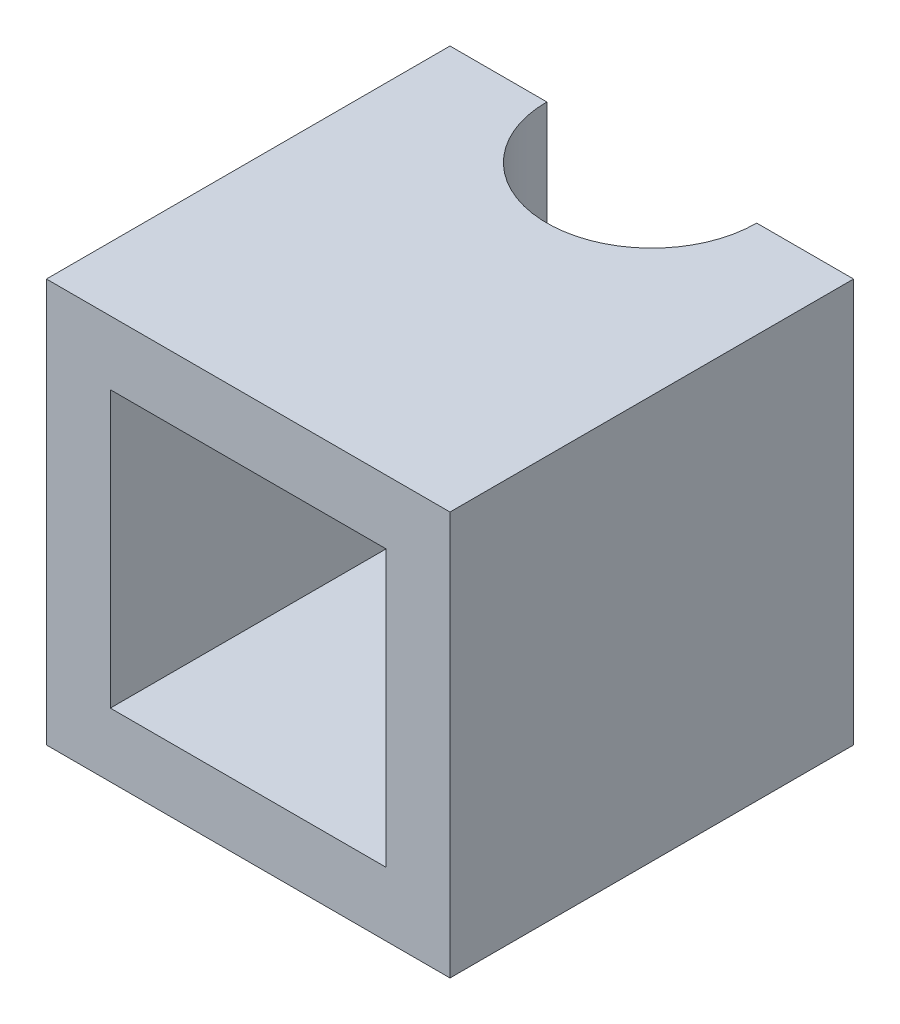
ISO-10303-21;
HEADER;
FILE_DESCRIPTION(('STEP AP214'),'2;1');
FILE_NAME('part.step','',(''),(''),'','','');
FILE_SCHEMA(('AUTOMOTIVE_DESIGN { 1 0 10303 214 1 1 1 1 }'));
ENDSEC;
DATA;
#1=APPLICATION_CONTEXT('core data for automotive mechanical design processes');
#2=APPLICATION_PROTOCOL_DEFINITION('international standard','automotive_design',2000,#1);
#3=PRODUCT_CONTEXT('',#1,'mechanical');
#4=PRODUCT('Part','Part','',(#3));
#5=PRODUCT_RELATED_PRODUCT_CATEGORY('part','',(#4));
#6=PRODUCT_DEFINITION_FORMATION('','',#4);
#7=PRODUCT_DEFINITION_CONTEXT('part definition',#1,'design');
#8=PRODUCT_DEFINITION('design','',#6,#7);
#9=PRODUCT_DEFINITION_SHAPE('','',#8);
#10=(LENGTH_UNIT() NAMED_UNIT(*) SI_UNIT(.MILLI.,.METRE.));
#11=(NAMED_UNIT(*) PLANE_ANGLE_UNIT() SI_UNIT($,.RADIAN.));
#12=(NAMED_UNIT(*) SI_UNIT($,.STERADIAN.) SOLID_ANGLE_UNIT());
#13=UNCERTAINTY_MEASURE_WITH_UNIT(LENGTH_MEASURE(1.E-05),#10,'distance_accuracy_value','');
#14=(GEOMETRIC_REPRESENTATION_CONTEXT(3) GLOBAL_UNCERTAINTY_ASSIGNED_CONTEXT((#13)) GLOBAL_UNIT_ASSIGNED_CONTEXT((#10,
#11,#12)) REPRESENTATION_CONTEXT('',''));
#15=CARTESIAN_POINT('',(0.,0.,0.));
#16=DIRECTION('',(0.,0.,1.));
#17=DIRECTION('',(1.,0.,0.));
#18=AXIS2_PLACEMENT_3D('',#15,#16,#17);
#19=CARTESIAN_POINT('',(0.,0.,-10.));
#20=DIRECTION('',(0.,1.,0.));
#21=DIRECTION('',(0.,0.,-1.));
#22=AXIS2_PLACEMENT_3D('',#19,#20,#21);
#23=CYLINDRICAL_SURFACE('',#22,10.8);
#24=DIRECTION('',(0.,1.,0.));
#25=VECTOR('',#24,1.);
#26=CARTESIAN_POINT('',(7.25534285888682,0.,-2.));
#27=LINE('',#26,#25);
#28=CARTESIAN_POINT('',(7.25534285888682,-9.95000000000001,-2.));
#29=VERTEX_POINT('',#28);
#30=CARTESIAN_POINT('',(7.25534285888682,-6.45000000000001,-2.));
#31=VERTEX_POINT('',#30);
#32=EDGE_CURVE('E246',#29,#31,#27,.T.);
#33=ORIENTED_EDGE('',*,*,#32,.F.);
#34=CARTESIAN_POINT('',(0.,-9.95000000000001,-10.));
#35=DIRECTION('',(0.,-1.,0.));
#36=DIRECTION('',(0.,0.,-1.));
#37=AXIS2_PLACEMENT_3D('',#34,#35,#36);
#38=CIRCLE('',#37,10.8);
#39=CARTESIAN_POINT('',(10.8,-9.95000000000001,-10.0000000000001));
#40=VERTEX_POINT('',#39);
#41=EDGE_CURVE('E282',#40,#29,#38,.T.);
#42=ORIENTED_EDGE('',*,*,#41,.F.);
#43=DIRECTION('',(0.,1.,0.));
#44=VECTOR('',#43,1.);
#45=CARTESIAN_POINT('',(10.8,-9.95000000000001,-10.0000000000001));
#46=LINE('',#45,#44);
#47=CARTESIAN_POINT('',(10.8,-6.45000000000001,-10.0000000000001));
#48=VERTEX_POINT('',#47);
#49=EDGE_CURVE('E272',#40,#48,#46,.T.);
#50=ORIENTED_EDGE('',*,*,#49,.T.);
#51=CARTESIAN_POINT('',(0.,-6.45000000000001,-10.));
#52=DIRECTION('',(0.,-1.,0.));
#53=DIRECTION('',(0.,0.,-1.));
#54=AXIS2_PLACEMENT_3D('',#51,#52,#53);
#55=CIRCLE('',#54,10.8);
#56=EDGE_CURVE('E294',#48,#31,#55,.T.);
#57=ORIENTED_EDGE('',*,*,#56,.T.);
#58=EDGE_LOOP('',(#33,#42,#50,#57));
#59=FACE_BOUND('',#58,.T.);
#60=ADVANCED_FACE('F33',(#59),#23,.T.);
#61=DIRECTION('',(0.,1.,0.));
#62=VECTOR('',#61,1.);
#63=CARTESIAN_POINT('',(-7.25534285888682,0.,-2.));
#64=LINE('',#63,#62);
#65=CARTESIAN_POINT('',(-7.25534285888682,-6.45000000000001,-2.));
#66=VERTEX_POINT('',#65);
#67=CARTESIAN_POINT('',(-7.25534285888682,-9.95000000000001,-2.));
#68=VERTEX_POINT('',#67);
#69=EDGE_CURVE('E241',#66,#68,#64,.F.);
#70=ORIENTED_EDGE('',*,*,#69,.F.);
#71=CARTESIAN_POINT('',(-10.8,-6.45000000000001,-10.));
#72=VERTEX_POINT('',#71);
#73=EDGE_CURVE('E293',#66,#72,#55,.T.);
#74=ORIENTED_EDGE('',*,*,#73,.T.);
#75=DIRECTION('',(0.,1.,0.));
#76=VECTOR('',#75,1.);
#77=CARTESIAN_POINT('',(-10.8,-9.95000000000001,-10.));
#78=LINE('',#77,#76);
#79=CARTESIAN_POINT('',(-10.8,-9.95000000000001,-10.));
#80=VERTEX_POINT('',#79);
#81=EDGE_CURVE('E260',#80,#72,#78,.T.);
#82=ORIENTED_EDGE('',*,*,#81,.F.);
#83=EDGE_CURVE('E281',#68,#80,#38,.T.);
#84=ORIENTED_EDGE('',*,*,#83,.F.);
#85=EDGE_LOOP('',(#70,#74,#82,#84));
#86=FACE_BOUND('',#85,.T.);
#87=ADVANCED_FACE('F438',(#86),#23,.T.);
#88=CARTESIAN_POINT('',(0.,0.,-10.));
#89=DIRECTION('',(0.,-1.,0.));
#90=DIRECTION('',(0.,0.,-1.));
#91=AXIS2_PLACEMENT_3D('',#88,#89,#90);
#92=CYLINDRICAL_SURFACE('',#91,10.8);
#93=DIRECTION('',(0.,-1.,0.));
#94=VECTOR('',#93,1.);
#95=CARTESIAN_POINT('',(-7.25534285888682,0.,-2.));
#96=LINE('',#95,#94);
#97=CARTESIAN_POINT('',(-7.25534285888682,9.95000000000001,-2.));
#98=VERTEX_POINT('',#97);
#99=CARTESIAN_POINT('',(-7.25534285888682,6.45000000000001,-2.));
#100=VERTEX_POINT('',#99);
#101=EDGE_CURVE('E258',#98,#100,#96,.T.);
#102=ORIENTED_EDGE('',*,*,#101,.F.);
#103=CARTESIAN_POINT('',(0.,9.95000000000001,-10.));
#104=DIRECTION('',(0.,-1.,0.));
#105=DIRECTION('',(0.,0.,-1.));
#106=AXIS2_PLACEMENT_3D('',#103,#104,#105);
#107=CIRCLE('',#106,10.8);
#108=CARTESIAN_POINT('',(-10.8,9.95000000000001,-10.));
#109=VERTEX_POINT('',#108);
#110=EDGE_CURVE('E324',#98,#109,#107,.T.);
#111=ORIENTED_EDGE('',*,*,#110,.T.);
#112=DIRECTION('',(0.,-1.,0.));
#113=VECTOR('',#112,1.);
#114=CARTESIAN_POINT('',(-10.8,9.95000000000001,-10.));
#115=LINE('',#114,#113);
#116=CARTESIAN_POINT('',(-10.8,6.45000000000001,-10.));
#117=VERTEX_POINT('',#116);
#118=EDGE_CURVE('E300',#109,#117,#115,.T.);
#119=ORIENTED_EDGE('',*,*,#118,.T.);
#120=CARTESIAN_POINT('',(0.,6.45000000000001,-10.));
#121=DIRECTION('',(0.,-1.,0.));
#122=DIRECTION('',(0.,0.,-1.));
#123=AXIS2_PLACEMENT_3D('',#120,#121,#122);
#124=CIRCLE('',#123,10.8);
#125=EDGE_CURVE('E336',#100,#117,#124,.T.);
#126=ORIENTED_EDGE('',*,*,#125,.F.);
#127=EDGE_LOOP('',(#102,#111,#119,#126));
#128=FACE_BOUND('',#127,.T.);
#129=ADVANCED_FACE('F444',(#128),#92,.T.);
#130=DIRECTION('',(0.,-1.,0.));
#131=VECTOR('',#130,1.);
#132=CARTESIAN_POINT('',(7.25534285888682,0.,-2.));
#133=LINE('',#132,#131);
#134=CARTESIAN_POINT('',(7.25534285888682,6.45000000000001,-2.));
#135=VERTEX_POINT('',#134);
#136=CARTESIAN_POINT('',(7.25534285888682,9.95000000000001,-2.));
#137=VERTEX_POINT('',#136);
#138=EDGE_CURVE('E254',#135,#137,#133,.F.);
#139=ORIENTED_EDGE('',*,*,#138,.F.);
#140=CARTESIAN_POINT('',(10.8,6.45000000000001,-10.0000000000001));
#141=VERTEX_POINT('',#140);
#142=EDGE_CURVE('E337',#141,#135,#124,.T.);
#143=ORIENTED_EDGE('',*,*,#142,.F.);
#144=DIRECTION('',(0.,-1.,0.));
#145=VECTOR('',#144,1.);
#146=CARTESIAN_POINT('',(10.8,9.95000000000001,-10.0000000000001));
#147=LINE('',#146,#145);
#148=CARTESIAN_POINT('',(10.8,9.95000000000001,-10.));
#149=VERTEX_POINT('',#148);
#150=EDGE_CURVE('E312',#149,#141,#147,.T.);
#151=ORIENTED_EDGE('',*,*,#150,.F.);
#152=EDGE_CURVE('E325',#149,#137,#107,.T.);
#153=ORIENTED_EDGE('',*,*,#152,.T.);
#154=EDGE_LOOP('',(#139,#143,#151,#153));
#155=FACE_BOUND('',#154,.T.);
#156=ADVANCED_FACE('F467',(#155),#92,.T.);
#157=CARTESIAN_POINT('',(0.,0.,-10.));
#158=DIRECTION('',(0.,-1.,0.));
#159=DIRECTION('',(0.,0.,-1.));
#160=AXIS2_PLACEMENT_3D('',#157,#158,#159);
#161=CYLINDRICAL_SURFACE('',#160,12.3);
#162=DIRECTION('',(0.,-1.,0.));
#163=VECTOR('',#162,1.);
#164=CARTESIAN_POINT('',(-9.34291175169711,0.,-2.));
#165=LINE('',#164,#163);
#166=CARTESIAN_POINT('',(-9.34291175169711,6.45000000000001,-2.));
#167=VERTEX_POINT('',#166);
#168=CARTESIAN_POINT('',(-9.34291175169711,9.95000000000001,-2.));
#169=VERTEX_POINT('',#168);
#170=EDGE_CURVE('E48',#167,#169,#165,.F.);
#171=ORIENTED_EDGE('',*,*,#170,.F.);
#172=CARTESIAN_POINT('',(0.,6.45000000000001,-10.));
#173=DIRECTION('',(0.,-1.,0.));
#174=DIRECTION('',(0.,0.,-1.));
#175=AXIS2_PLACEMENT_3D('',#172,#173,#174);
#176=CIRCLE('',#175,12.3);
#177=CARTESIAN_POINT('',(-12.3,6.45000000000001,-10.));
#178=VERTEX_POINT('',#177);
#179=EDGE_CURVE('E332',#167,#178,#176,.T.);
#180=ORIENTED_EDGE('',*,*,#179,.T.);
#181=DIRECTION('',(0.,1.,0.));
#182=VECTOR('',#181,1.);
#183=CARTESIAN_POINT('',(-12.3,9.95000000000001,-10.));
#184=LINE('',#183,#182);
#185=CARTESIAN_POINT('',(-12.3,9.95000000000001,-10.));
#186=VERTEX_POINT('',#185);
#187=EDGE_CURVE('E306',#178,#186,#184,.T.);
#188=ORIENTED_EDGE('',*,*,#187,.T.);
#189=CARTESIAN_POINT('',(0.,9.95000000000001,-10.));
#190=DIRECTION('',(0.,-1.,0.));
#191=DIRECTION('',(0.,0.,-1.));
#192=AXIS2_PLACEMENT_3D('',#189,#190,#191);
#193=CIRCLE('',#192,12.3);
#194=EDGE_CURVE('E328',#169,#186,#193,.T.);
#195=ORIENTED_EDGE('',*,*,#194,.F.);
#196=EDGE_LOOP('',(#171,#180,#188,#195));
#197=FACE_BOUND('',#196,.T.);
#198=ADVANCED_FACE('F475',(#197),#161,.F.);
#199=CARTESIAN_POINT('',(10.8,6.45000000000001,-10.0000000000001));
#200=DIRECTION('',(0.,-1.,0.));
#201=DIRECTION('',(0.,0.,-1.));
#202=AXIS2_PLACEMENT_3D('',#199,#200,#201);
#203=PLANE('',#202);
#204=DIRECTION('',(-1.,0.,0.));
#205=VECTOR('',#204,1.);
#206=CARTESIAN_POINT('',(10.8,6.45000000000001,-2.));
#207=LINE('',#206,#205);
#208=CARTESIAN_POINT('',(9.34291175169711,6.45000000000001,-2.));
#209=VERTEX_POINT('',#208);
#210=EDGE_CURVE('E251',#209,#135,#207,.T.);
#211=ORIENTED_EDGE('',*,*,#210,.F.);
#212=CARTESIAN_POINT('',(12.3,6.45000000000001,-10.0000000000001));
#213=VERTEX_POINT('',#212);
#214=EDGE_CURVE('E333',#213,#209,#176,.T.);
#215=ORIENTED_EDGE('',*,*,#214,.F.);
#216=DIRECTION('',(1.,0.,0.));
#217=VECTOR('',#216,1.);
#218=CARTESIAN_POINT('',(10.8,6.45000000000001,-10.0000000000001));
#219=LINE('',#218,#217);
#220=EDGE_CURVE('E315',#141,#213,#219,.T.);
#221=ORIENTED_EDGE('',*,*,#220,.F.);
#222=ORIENTED_EDGE('',*,*,#142,.T.);
#223=EDGE_LOOP('',(#211,#215,#221,#222));
#224=FACE_BOUND('',#223,.T.);
#225=ADVANCED_FACE('F478',(#224),#203,.F.);
#226=EDGE_CURVE('E255',#100,#167,#207,.T.);
#227=ORIENTED_EDGE('',*,*,#226,.F.);
#228=ORIENTED_EDGE('',*,*,#125,.T.);
#229=DIRECTION('',(-1.,0.,0.));
#230=VECTOR('',#229,1.);
#231=CARTESIAN_POINT('',(-10.8,6.45000000000001,-10.));
#232=LINE('',#231,#230);
#233=EDGE_CURVE('E303',#117,#178,#232,.T.);
#234=ORIENTED_EDGE('',*,*,#233,.T.);
#235=ORIENTED_EDGE('',*,*,#179,.F.);
#236=EDGE_LOOP('',(#227,#228,#234,#235));
#237=FACE_BOUND('',#236,.T.);
#238=ADVANCED_FACE('F473',(#237),#203,.F.);
#239=CARTESIAN_POINT('',(10.8,9.95000000000001,-10.0000000000001));
#240=DIRECTION('',(0.,1.,0.));
#241=DIRECTION('',(0.,0.,1.));
#242=AXIS2_PLACEMENT_3D('',#239,#240,#241);
#243=PLANE('',#242);
#244=DIRECTION('',(1.,0.,0.));
#245=VECTOR('',#244,1.);
#246=CARTESIAN_POINT('',(10.8,9.95000000000001,-2.));
#247=LINE('',#246,#245);
#248=EDGE_CURVE('E252',#169,#98,#247,.T.);
#249=ORIENTED_EDGE('',*,*,#248,.F.);
#250=ORIENTED_EDGE('',*,*,#194,.T.);
#251=DIRECTION('',(1.,0.,0.));
#252=VECTOR('',#251,1.);
#253=CARTESIAN_POINT('',(-10.8,9.95000000000001,-10.));
#254=LINE('',#253,#252);
#255=EDGE_CURVE('E309',#186,#109,#254,.T.);
#256=ORIENTED_EDGE('',*,*,#255,.T.);
#257=ORIENTED_EDGE('',*,*,#110,.F.);
#258=EDGE_LOOP('',(#249,#250,#256,#257));
#259=FACE_BOUND('',#258,.T.);
#260=ADVANCED_FACE('F469',(#259),#243,.F.);
#261=CARTESIAN_POINT('',(9.34291175169711,9.95000000000001,-2.));
#262=VERTEX_POINT('',#261);
#263=EDGE_CURVE('E56',#137,#262,#247,.T.);
#264=ORIENTED_EDGE('',*,*,#263,.F.);
#265=ORIENTED_EDGE('',*,*,#152,.F.);
#266=DIRECTION('',(-1.,0.,0.));
#267=VECTOR('',#266,1.);
#268=CARTESIAN_POINT('',(10.8,9.95000000000001,-10.0000000000001));
#269=LINE('',#268,#267);
#270=CARTESIAN_POINT('',(12.3,9.95000000000001,-10.0000000000001));
#271=VERTEX_POINT('',#270);
#272=EDGE_CURVE('E321',#271,#149,#269,.T.);
#273=ORIENTED_EDGE('',*,*,#272,.F.);
#274=EDGE_CURVE('E329',#271,#262,#193,.T.);
#275=ORIENTED_EDGE('',*,*,#274,.T.);
#276=EDGE_LOOP('',(#264,#265,#273,#275));
#277=FACE_BOUND('',#276,.T.);
#278=ADVANCED_FACE('F472',(#277),#243,.F.);
#279=DIRECTION('',(0.,-1.,0.));
#280=VECTOR('',#279,1.);
#281=CARTESIAN_POINT('',(9.34291175169711,0.,-2.));
#282=LINE('',#281,#280);
#283=EDGE_CURVE('E248',#262,#209,#282,.T.);
#284=ORIENTED_EDGE('',*,*,#283,.F.);
#285=ORIENTED_EDGE('',*,*,#274,.F.);
#286=DIRECTION('',(0.,1.,0.));
#287=VECTOR('',#286,1.);
#288=CARTESIAN_POINT('',(12.3,9.95000000000001,-10.0000000000001));
#289=LINE('',#288,#287);
#290=EDGE_CURVE('E318',#213,#271,#289,.T.);
#291=ORIENTED_EDGE('',*,*,#290,.F.);
#292=ORIENTED_EDGE('',*,*,#214,.T.);
#293=EDGE_LOOP('',(#284,#285,#291,#292));
#294=FACE_BOUND('',#293,.T.);
#295=ADVANCED_FACE('F459',(#294),#161,.F.);
#296=CARTESIAN_POINT('',(0.,0.,-10.));
#297=DIRECTION('',(0.,1.,0.));
#298=DIRECTION('',(0.,0.,-1.));
#299=AXIS2_PLACEMENT_3D('',#296,#297,#298);
#300=CYLINDRICAL_SURFACE('',#299,12.3);
#301=DIRECTION('',(0.,1.,0.));
#302=VECTOR('',#301,1.);
#303=CARTESIAN_POINT('',(9.34291175169711,0.,-2.));
#304=LINE('',#303,#302);
#305=CARTESIAN_POINT('',(9.34291175169711,-6.45000000000001,-2.));
#306=VERTEX_POINT('',#305);
#307=CARTESIAN_POINT('',(9.34291175169711,-9.95000000000001,-2.));
#308=VERTEX_POINT('',#307);
#309=EDGE_CURVE('E244',#306,#308,#304,.F.);
#310=ORIENTED_EDGE('',*,*,#309,.F.);
#311=CARTESIAN_POINT('',(0.,-6.45000000000001,-10.));
#312=DIRECTION('',(0.,-1.,0.));
#313=DIRECTION('',(0.,0.,-1.));
#314=AXIS2_PLACEMENT_3D('',#311,#312,#313);
#315=CIRCLE('',#314,12.3);
#316=CARTESIAN_POINT('',(12.3,-6.45000000000001,-10.0000000000001));
#317=VERTEX_POINT('',#316);
#318=EDGE_CURVE('E290',#317,#306,#315,.T.);
#319=ORIENTED_EDGE('',*,*,#318,.F.);
#320=DIRECTION('',(0.,-1.,0.));
#321=VECTOR('',#320,1.);
#322=CARTESIAN_POINT('',(12.3,-9.95000000000001,-10.0000000000001));
#323=LINE('',#322,#321);
#324=CARTESIAN_POINT('',(12.3,-9.95000000000001,-10.));
#325=VERTEX_POINT('',#324);
#326=EDGE_CURVE('E276',#317,#325,#323,.T.);
#327=ORIENTED_EDGE('',*,*,#326,.T.);
#328=CARTESIAN_POINT('',(0.,-9.95000000000001,-10.));
#329=DIRECTION('',(0.,-1.,0.));
#330=DIRECTION('',(0.,0.,-1.));
#331=AXIS2_PLACEMENT_3D('',#328,#329,#330);
#332=CIRCLE('',#331,12.3);
#333=EDGE_CURVE('E286',#325,#308,#332,.T.);
#334=ORIENTED_EDGE('',*,*,#333,.T.);
#335=EDGE_LOOP('',(#310,#319,#327,#334));
#336=FACE_BOUND('',#335,.T.);
#337=ADVANCED_FACE('F455',(#336),#300,.F.);
#338=CARTESIAN_POINT('',(10.8,-6.45000000000001,-10.0000000000001));
#339=DIRECTION('',(0.,1.,0.));
#340=DIRECTION('',(0.,0.,-1.));
#341=AXIS2_PLACEMENT_3D('',#338,#339,#340);
#342=PLANE('',#341);
#343=DIRECTION('',(1.,0.,0.));
#344=VECTOR('',#343,1.);
#345=CARTESIAN_POINT('',(10.8,-6.45000000000001,-2.));
#346=LINE('',#345,#344);
#347=CARTESIAN_POINT('',(-9.34291175169711,-6.45000000000001,-2.));
#348=VERTEX_POINT('',#347);
#349=EDGE_CURVE('E238',#348,#66,#346,.T.);
#350=ORIENTED_EDGE('',*,*,#349,.F.);
#351=CARTESIAN_POINT('',(-12.3,-6.45000000000001,-10.));
#352=VERTEX_POINT('',#351);
#353=EDGE_CURVE('E289',#348,#352,#315,.T.);
#354=ORIENTED_EDGE('',*,*,#353,.T.);
#355=DIRECTION('',(-1.,0.,0.));
#356=VECTOR('',#355,1.);
#357=CARTESIAN_POINT('',(-10.8,-6.45000000000001,-10.));
#358=LINE('',#357,#356);
#359=EDGE_CURVE('E263',#72,#352,#358,.T.);
#360=ORIENTED_EDGE('',*,*,#359,.F.);
#361=ORIENTED_EDGE('',*,*,#73,.F.);
#362=EDGE_LOOP('',(#350,#354,#360,#361));
#363=FACE_BOUND('',#362,.T.);
#364=ADVANCED_FACE('F458',(#363),#342,.F.);
#365=EDGE_CURVE('E242',#31,#306,#346,.T.);
#366=ORIENTED_EDGE('',*,*,#365,.F.);
#367=ORIENTED_EDGE('',*,*,#56,.F.);
#368=DIRECTION('',(1.,0.,0.));
#369=VECTOR('',#368,1.);
#370=CARTESIAN_POINT('',(10.8,-6.45000000000001,-10.0000000000001));
#371=LINE('',#370,#369);
#372=EDGE_CURVE('E274',#48,#317,#371,.T.);
#373=ORIENTED_EDGE('',*,*,#372,.T.);
#374=ORIENTED_EDGE('',*,*,#318,.T.);
#375=EDGE_LOOP('',(#366,#367,#373,#374));
#376=FACE_BOUND('',#375,.T.);
#377=ADVANCED_FACE('F453',(#376),#342,.F.);
#378=CARTESIAN_POINT('',(10.8,-9.95000000000001,-10.0000000000001));
#379=DIRECTION('',(0.,-1.,0.));
#380=DIRECTION('',(0.,0.,1.));
#381=AXIS2_PLACEMENT_3D('',#378,#379,#380);
#382=PLANE('',#381);
#383=DIRECTION('',(-1.,0.,0.));
#384=VECTOR('',#383,1.);
#385=CARTESIAN_POINT('',(10.8,-9.95000000000001,-2.));
#386=LINE('',#385,#384);
#387=EDGE_CURVE('E239',#308,#29,#386,.T.);
#388=ORIENTED_EDGE('',*,*,#387,.F.);
#389=ORIENTED_EDGE('',*,*,#333,.F.);
#390=DIRECTION('',(-1.,0.,0.));
#391=VECTOR('',#390,1.);
#392=CARTESIAN_POINT('',(10.8,-9.95000000000001,-10.0000000000001));
#393=LINE('',#392,#391);
#394=EDGE_CURVE('E279',#325,#40,#393,.T.);
#395=ORIENTED_EDGE('',*,*,#394,.T.);
#396=ORIENTED_EDGE('',*,*,#41,.T.);
#397=EDGE_LOOP('',(#388,#389,#395,#396));
#398=FACE_BOUND('',#397,.T.);
#399=ADVANCED_FACE('F449',(#398),#382,.F.);
#400=CARTESIAN_POINT('',(-9.34291175169711,-9.95000000000001,-2.));
#401=VERTEX_POINT('',#400);
#402=EDGE_CURVE('E236',#68,#401,#386,.T.);
#403=ORIENTED_EDGE('',*,*,#402,.F.);
#404=ORIENTED_EDGE('',*,*,#83,.T.);
#405=DIRECTION('',(1.,0.,0.));
#406=VECTOR('',#405,1.);
#407=CARTESIAN_POINT('',(-10.8,-9.95000000000001,-10.));
#408=LINE('',#407,#406);
#409=CARTESIAN_POINT('',(-12.3,-9.95000000000001,-10.));
#410=VERTEX_POINT('',#409);
#411=EDGE_CURVE('E269',#410,#80,#408,.T.);
#412=ORIENTED_EDGE('',*,*,#411,.F.);
#413=EDGE_CURVE('E285',#401,#410,#332,.T.);
#414=ORIENTED_EDGE('',*,*,#413,.F.);
#415=EDGE_LOOP('',(#403,#404,#412,#414));
#416=FACE_BOUND('',#415,.T.);
#417=ADVANCED_FACE('F452',(#416),#382,.F.);
#418=DIRECTION('',(0.,1.,0.));
#419=VECTOR('',#418,1.);
#420=CARTESIAN_POINT('',(-9.34291175169711,0.,-2.));
#421=LINE('',#420,#419);
#422=EDGE_CURVE('E11',#401,#348,#421,.T.);
#423=ORIENTED_EDGE('',*,*,#422,.F.);
#424=ORIENTED_EDGE('',*,*,#413,.T.);
#425=DIRECTION('',(0.,-1.,0.));
#426=VECTOR('',#425,1.);
#427=CARTESIAN_POINT('',(-12.3,-9.95000000000001,-10.));
#428=LINE('',#427,#426);
#429=EDGE_CURVE('E266',#352,#410,#428,.T.);
#430=ORIENTED_EDGE('',*,*,#429,.F.);
#431=ORIENTED_EDGE('',*,*,#353,.F.);
#432=EDGE_LOOP('',(#423,#424,#430,#431));
#433=FACE_BOUND('',#432,.T.);
#434=ADVANCED_FACE('F461',(#433),#300,.F.);
#435=CARTESIAN_POINT('',(0.,0.,-10.));
#436=DIRECTION('',(0.,0.,1.));
#437=DIRECTION('',(1.,0.,0.));
#438=AXIS2_PLACEMENT_3D('',#435,#436,#437);
#439=PLANE('',#438);
#440=ORIENTED_EDGE('',*,*,#372,.F.);
#441=ORIENTED_EDGE('',*,*,#49,.F.);
#442=ORIENTED_EDGE('',*,*,#394,.F.);
#443=ORIENTED_EDGE('',*,*,#326,.F.);
#444=EDGE_LOOP('',(#440,#441,#442,#443));
#445=FACE_BOUND('',#444,.T.);
#446=ORIENTED_EDGE('',*,*,#272,.T.);
#447=ORIENTED_EDGE('',*,*,#150,.T.);
#448=ORIENTED_EDGE('',*,*,#220,.T.);
#449=ORIENTED_EDGE('',*,*,#290,.T.);
#450=EDGE_LOOP('',(#446,#447,#448,#449));
#451=FACE_BOUND('',#450,.T.);
#452=DIRECTION('',(-1.,0.,0.));
#453=VECTOR('',#452,1.);
#454=CARTESIAN_POINT('',(15.,-15.,-10.));
#455=LINE('',#454,#453);
#456=CARTESIAN_POINT('',(15.,-15.,-10.));
#457=VERTEX_POINT('',#456);
#458=CARTESIAN_POINT('',(7.8,-15.,-10.0000000000001));
#459=VERTEX_POINT('',#458);
#460=EDGE_CURVE('E359',#457,#459,#455,.T.);
#461=ORIENTED_EDGE('',*,*,#460,.T.);
#462=DIRECTION('',(0.,1.,0.));
#463=VECTOR('',#462,1.);
#464=CARTESIAN_POINT('',(7.8,0.,-10.0000000000001));
#465=LINE('',#464,#463);
#466=CARTESIAN_POINT('',(7.8,15.,-10.));
#467=VERTEX_POINT('',#466);
#468=EDGE_CURVE('E342',#459,#467,#465,.T.);
#469=ORIENTED_EDGE('',*,*,#468,.T.);
#470=DIRECTION('',(1.,0.,0.));
#471=VECTOR('',#470,1.);
#472=CARTESIAN_POINT('',(15.,15.,-10.));
#473=LINE('',#472,#471);
#474=CARTESIAN_POINT('',(15.,15.,-10.));
#475=VERTEX_POINT('',#474);
#476=EDGE_CURVE('E351',#467,#475,#473,.T.);
#477=ORIENTED_EDGE('',*,*,#476,.T.);
#478=DIRECTION('',(0.,-1.,0.));
#479=VECTOR('',#478,1.);
#480=CARTESIAN_POINT('',(15.,-15.,-10.));
#481=LINE('',#480,#479);
#482=EDGE_CURVE('E355',#475,#457,#481,.T.);
#483=ORIENTED_EDGE('',*,*,#482,.T.);
#484=EDGE_LOOP('',(#461,#469,#477,#483));
#485=FACE_BOUND('',#484,.T.);
#486=ADVANCED_FACE('F401',(#445,#451,#485),#439,.F.);
#487=CARTESIAN_POINT('',(0.,0.,20.));
#488=DIRECTION('',(0.,0.,-1.));
#489=DIRECTION('',(-1.,0.,0.));
#490=AXIS2_PLACEMENT_3D('',#487,#488,#489);
#491=PLANE('',#490);
#492=DIRECTION('',(0.,1.,0.));
#493=VECTOR('',#492,1.);
#494=CARTESIAN_POINT('',(15.,-15.,20.));
#495=LINE('',#494,#493);
#496=CARTESIAN_POINT('',(15.,-15.,20.));
#497=VERTEX_POINT('',#496);
#498=CARTESIAN_POINT('',(15.,15.,20.));
#499=VERTEX_POINT('',#498);
#500=EDGE_CURVE('E216',#497,#499,#495,.T.);
#501=ORIENTED_EDGE('',*,*,#500,.T.);
#502=DIRECTION('',(-1.,0.,0.));
#503=VECTOR('',#502,1.);
#504=CARTESIAN_POINT('',(-15.,15.,20.));
#505=LINE('',#504,#503);
#506=CARTESIAN_POINT('',(-15.,15.,20.));
#507=VERTEX_POINT('',#506);
#508=EDGE_CURVE('E377',#499,#507,#505,.T.);
#509=ORIENTED_EDGE('',*,*,#508,.T.);
#510=DIRECTION('',(0.,-1.,0.));
#511=VECTOR('',#510,1.);
#512=CARTESIAN_POINT('',(-15.,-15.,20.));
#513=LINE('',#512,#511);
#514=CARTESIAN_POINT('',(-15.,-15.,20.));
#515=VERTEX_POINT('',#514);
#516=EDGE_CURVE('E379',#507,#515,#513,.T.);
#517=ORIENTED_EDGE('',*,*,#516,.T.);
#518=DIRECTION('',(1.,0.,0.));
#519=VECTOR('',#518,1.);
#520=CARTESIAN_POINT('',(-15.,-15.,20.));
#521=LINE('',#520,#519);
#522=EDGE_CURVE('E381',#515,#497,#521,.T.);
#523=ORIENTED_EDGE('',*,*,#522,.T.);
#524=EDGE_LOOP('',(#501,#509,#517,#523));
#525=FACE_BOUND('',#524,.T.);
#526=DIRECTION('',(0.,1.,0.));
#527=VECTOR('',#526,1.);
#528=CARTESIAN_POINT('',(10.25,-10.25,20.));
#529=LINE('',#528,#527);
#530=CARTESIAN_POINT('',(10.25,-10.25,20.));
#531=VERTEX_POINT('',#530);
#532=CARTESIAN_POINT('',(10.25,10.25,20.));
#533=VERTEX_POINT('',#532);
#534=EDGE_CURVE('E213',#531,#533,#529,.T.);
#535=ORIENTED_EDGE('',*,*,#534,.F.);
#536=DIRECTION('',(1.,0.,0.));
#537=VECTOR('',#536,1.);
#538=CARTESIAN_POINT('',(-10.25,-10.25,20.));
#539=LINE('',#538,#537);
#540=CARTESIAN_POINT('',(-10.25,-10.25,20.));
#541=VERTEX_POINT('',#540);
#542=EDGE_CURVE('E368',#541,#531,#539,.T.);
#543=ORIENTED_EDGE('',*,*,#542,.F.);
#544=DIRECTION('',(0.,-1.,0.));
#545=VECTOR('',#544,1.);
#546=CARTESIAN_POINT('',(-10.25,-10.25,20.));
#547=LINE('',#546,#545);
#548=CARTESIAN_POINT('',(-10.25,10.25,20.));
#549=VERTEX_POINT('',#548);
#550=EDGE_CURVE('E365',#549,#541,#547,.T.);
#551=ORIENTED_EDGE('',*,*,#550,.F.);
#552=DIRECTION('',(-1.,0.,0.));
#553=VECTOR('',#552,1.);
#554=CARTESIAN_POINT('',(-10.25,10.25,20.));
#555=LINE('',#554,#553);
#556=EDGE_CURVE('E363',#533,#549,#555,.T.);
#557=ORIENTED_EDGE('',*,*,#556,.F.);
#558=EDGE_LOOP('',(#535,#543,#551,#557));
#559=FACE_BOUND('',#558,.T.);
#560=ADVANCED_FACE('F418',(#525,#559),#491,.F.);
#561=CARTESIAN_POINT('',(15.,-15.,20.));
#562=DIRECTION('',(-1.,0.,0.));
#563=DIRECTION('',(0.,0.,1.));
#564=AXIS2_PLACEMENT_3D('',#561,#562,#563);
#565=PLANE('',#564);
#566=DIRECTION('',(0.,0.,-1.));
#567=VECTOR('',#566,1.);
#568=CARTESIAN_POINT('',(15.,-15.,20.));
#569=LINE('',#568,#567);
#570=EDGE_CURVE('E383',#497,#457,#569,.T.);
#571=ORIENTED_EDGE('',*,*,#570,.T.);
#572=ORIENTED_EDGE('',*,*,#482,.F.);
#573=DIRECTION('',(0.,0.,-1.));
#574=VECTOR('',#573,1.);
#575=CARTESIAN_POINT('',(15.,15.,20.));
#576=LINE('',#575,#574);
#577=EDGE_CURVE('E41',#499,#475,#576,.T.);
#578=ORIENTED_EDGE('',*,*,#577,.F.);
#579=ORIENTED_EDGE('',*,*,#500,.F.);
#580=EDGE_LOOP('',(#571,#572,#578,#579));
#581=FACE_BOUND('',#580,.T.);
#582=ADVANCED_FACE('F35',(#581),#565,.F.);
#583=CARTESIAN_POINT('',(-15.,15.,20.));
#584=DIRECTION('',(0.,-1.,0.));
#585=DIRECTION('',(0.,0.,-1.));
#586=AXIS2_PLACEMENT_3D('',#583,#584,#585);
#587=PLANE('',#586);
#588=ORIENTED_EDGE('',*,*,#476,.F.);
#589=CARTESIAN_POINT('',(0.,15.,-10.));
#590=DIRECTION('',(0.,-1.,0.));
#591=DIRECTION('',(0.,0.,-1.));
#592=AXIS2_PLACEMENT_3D('',#589,#590,#591);
#593=CIRCLE('',#592,7.8);
#594=CARTESIAN_POINT('',(-7.8,15.,-10.));
#595=VERTEX_POINT('',#594);
#596=EDGE_CURVE('E345',#467,#595,#593,.T.);
#597=ORIENTED_EDGE('',*,*,#596,.T.);
#598=CARTESIAN_POINT('',(-15.,15.,-10.));
#599=VERTEX_POINT('',#598);
#600=EDGE_CURVE('E352',#599,#595,#473,.T.);
#601=ORIENTED_EDGE('',*,*,#600,.F.);
#602=DIRECTION('',(0.,0.,-1.));
#603=VECTOR('',#602,1.);
#604=CARTESIAN_POINT('',(-15.,15.,20.));
#605=LINE('',#604,#603);
#606=EDGE_CURVE('E388',#507,#599,#605,.T.);
#607=ORIENTED_EDGE('',*,*,#606,.F.);
#608=ORIENTED_EDGE('',*,*,#508,.F.);
#609=ORIENTED_EDGE('',*,*,#577,.T.);
#610=EDGE_LOOP('',(#588,#597,#601,#607,#608,#609));
#611=FACE_BOUND('',#610,.T.);
#612=ADVANCED_FACE('F394',(#611),#587,.F.);
#613=CARTESIAN_POINT('',(-15.,-15.,20.));
#614=DIRECTION('',(1.,0.,0.));
#615=DIRECTION('',(0.,0.,-1.));
#616=AXIS2_PLACEMENT_3D('',#613,#614,#615);
#617=PLANE('',#616);
#618=ORIENTED_EDGE('',*,*,#606,.T.);
#619=DIRECTION('',(0.,1.,0.));
#620=VECTOR('',#619,1.);
#621=CARTESIAN_POINT('',(-15.,-15.,-10.));
#622=LINE('',#621,#620);
#623=CARTESIAN_POINT('',(-15.,-15.,-10.));
#624=VERTEX_POINT('',#623);
#625=EDGE_CURVE('E348',#624,#599,#622,.T.);
#626=ORIENTED_EDGE('',*,*,#625,.F.);
#627=DIRECTION('',(0.,0.,-1.));
#628=VECTOR('',#627,1.);
#629=CARTESIAN_POINT('',(-15.,-15.,20.));
#630=LINE('',#629,#628);
#631=EDGE_CURVE('E385',#515,#624,#630,.T.);
#632=ORIENTED_EDGE('',*,*,#631,.F.);
#633=ORIENTED_EDGE('',*,*,#516,.F.);
#634=EDGE_LOOP('',(#618,#626,#632,#633));
#635=FACE_BOUND('',#634,.T.);
#636=ADVANCED_FACE('F415',(#635),#617,.F.);
#637=CARTESIAN_POINT('',(-15.,-15.,20.));
#638=DIRECTION('',(0.,1.,0.));
#639=DIRECTION('',(0.,0.,1.));
#640=AXIS2_PLACEMENT_3D('',#637,#638,#639);
#641=PLANE('',#640);
#642=CARTESIAN_POINT('',(-7.8,-15.,-10.));
#643=VERTEX_POINT('',#642);
#644=EDGE_CURVE('E358',#643,#624,#455,.T.);
#645=ORIENTED_EDGE('',*,*,#644,.F.);
#646=CARTESIAN_POINT('',(0.,-15.,-10.));
#647=DIRECTION('',(0.,-1.,0.));
#648=DIRECTION('',(0.,0.,-1.));
#649=AXIS2_PLACEMENT_3D('',#646,#647,#648);
#650=CIRCLE('',#649,7.8);
#651=EDGE_CURVE('E297',#459,#643,#650,.T.);
#652=ORIENTED_EDGE('',*,*,#651,.F.);
#653=ORIENTED_EDGE('',*,*,#460,.F.);
#654=ORIENTED_EDGE('',*,*,#570,.F.);
#655=ORIENTED_EDGE('',*,*,#522,.F.);
#656=ORIENTED_EDGE('',*,*,#631,.T.);
#657=EDGE_LOOP('',(#645,#652,#653,#654,#655,#656));
#658=FACE_BOUND('',#657,.T.);
#659=ADVANCED_FACE('F405',(#658),#641,.F.);
#660=CARTESIAN_POINT('',(10.25,-10.25,20.));
#661=DIRECTION('',(-1.,0.,0.));
#662=DIRECTION('',(0.,0.,1.));
#663=AXIS2_PLACEMENT_3D('',#660,#661,#662);
#664=PLANE('',#663);
#665=DIRECTION('',(0.,0.,-1.));
#666=VECTOR('',#665,1.);
#667=CARTESIAN_POINT('',(10.25,10.25,20.));
#668=LINE('',#667,#666);
#669=CARTESIAN_POINT('',(10.25,10.25,-2.));
#670=VERTEX_POINT('',#669);
#671=EDGE_CURVE('E205',#533,#670,#668,.T.);
#672=ORIENTED_EDGE('',*,*,#671,.T.);
#673=DIRECTION('',(0.,1.,0.));
#674=VECTOR('',#673,1.);
#675=CARTESIAN_POINT('',(10.25,-10.25,-2.));
#676=LINE('',#675,#674);
#677=CARTESIAN_POINT('',(10.25,-10.25,-2.));
#678=VERTEX_POINT('',#677);
#679=EDGE_CURVE('E210',#678,#670,#676,.T.);
#680=ORIENTED_EDGE('',*,*,#679,.F.);
#681=DIRECTION('',(0.,0.,-1.));
#682=VECTOR('',#681,1.);
#683=CARTESIAN_POINT('',(10.25,-10.25,20.));
#684=LINE('',#683,#682);
#685=EDGE_CURVE('E370',#531,#678,#684,.T.);
#686=ORIENTED_EDGE('',*,*,#685,.F.);
#687=ORIENTED_EDGE('',*,*,#534,.T.);
#688=EDGE_LOOP('',(#672,#680,#686,#687));
#689=FACE_BOUND('',#688,.T.);
#690=ADVANCED_FACE('F207',(#689),#664,.T.);
#691=CARTESIAN_POINT('',(-10.25,10.25,20.));
#692=DIRECTION('',(0.,-1.,0.));
#693=DIRECTION('',(0.,0.,-1.));
#694=AXIS2_PLACEMENT_3D('',#691,#692,#693);
#695=PLANE('',#694);
#696=DIRECTION('',(0.,0.,-1.));
#697=VECTOR('',#696,1.);
#698=CARTESIAN_POINT('',(-10.25,10.25,20.));
#699=LINE('',#698,#697);
#700=CARTESIAN_POINT('',(-10.25,10.25,-2.));
#701=VERTEX_POINT('',#700);
#702=EDGE_CURVE('E217',#549,#701,#699,.T.);
#703=ORIENTED_EDGE('',*,*,#702,.T.);
#704=DIRECTION('',(-1.,0.,0.));
#705=VECTOR('',#704,1.);
#706=CARTESIAN_POINT('',(10.25,10.25,-2.));
#707=LINE('',#706,#705);
#708=EDGE_CURVE('E220',#670,#701,#707,.T.);
#709=ORIENTED_EDGE('',*,*,#708,.F.);
#710=ORIENTED_EDGE('',*,*,#671,.F.);
#711=ORIENTED_EDGE('',*,*,#556,.T.);
#712=EDGE_LOOP('',(#703,#709,#710,#711));
#713=FACE_BOUND('',#712,.T.);
#714=ADVANCED_FACE('F221',(#713),#695,.T.);
#715=CARTESIAN_POINT('',(-10.25,-10.25,20.));
#716=DIRECTION('',(1.,0.,0.));
#717=DIRECTION('',(0.,0.,-1.));
#718=AXIS2_PLACEMENT_3D('',#715,#716,#717);
#719=PLANE('',#718);
#720=DIRECTION('',(0.,0.,-1.));
#721=VECTOR('',#720,1.);
#722=CARTESIAN_POINT('',(-10.25,-10.25,20.));
#723=LINE('',#722,#721);
#724=CARTESIAN_POINT('',(-10.25,-10.25,-2.));
#725=VERTEX_POINT('',#724);
#726=EDGE_CURVE('E372',#541,#725,#723,.T.);
#727=ORIENTED_EDGE('',*,*,#726,.T.);
#728=DIRECTION('',(0.,-1.,0.));
#729=VECTOR('',#728,1.);
#730=CARTESIAN_POINT('',(-10.25,-10.25,-2.));
#731=LINE('',#730,#729);
#732=EDGE_CURVE('E226',#701,#725,#731,.T.);
#733=ORIENTED_EDGE('',*,*,#732,.F.);
#734=ORIENTED_EDGE('',*,*,#702,.F.);
#735=ORIENTED_EDGE('',*,*,#550,.T.);
#736=EDGE_LOOP('',(#727,#733,#734,#735));
#737=FACE_BOUND('',#736,.T.);
#738=ADVANCED_FACE('F425',(#737),#719,.T.);
#739=CARTESIAN_POINT('',(-10.25,-10.25,20.));
#740=DIRECTION('',(0.,1.,0.));
#741=DIRECTION('',(0.,0.,1.));
#742=AXIS2_PLACEMENT_3D('',#739,#740,#741);
#743=PLANE('',#742);
#744=ORIENTED_EDGE('',*,*,#685,.T.);
#745=DIRECTION('',(1.,0.,0.));
#746=VECTOR('',#745,1.);
#747=CARTESIAN_POINT('',(10.25,-10.25,-2.));
#748=LINE('',#747,#746);
#749=EDGE_CURVE('E231',#725,#678,#748,.T.);
#750=ORIENTED_EDGE('',*,*,#749,.F.);
#751=ORIENTED_EDGE('',*,*,#726,.F.);
#752=ORIENTED_EDGE('',*,*,#542,.T.);
#753=EDGE_LOOP('',(#744,#750,#751,#752));
#754=FACE_BOUND('',#753,.T.);
#755=ADVANCED_FACE('F427',(#754),#743,.T.);
#756=ORIENTED_EDGE('',*,*,#411,.T.);
#757=ORIENTED_EDGE('',*,*,#81,.T.);
#758=ORIENTED_EDGE('',*,*,#359,.T.);
#759=ORIENTED_EDGE('',*,*,#429,.T.);
#760=EDGE_LOOP('',(#756,#757,#758,#759));
#761=FACE_BOUND('',#760,.T.);
#762=ORIENTED_EDGE('',*,*,#233,.F.);
#763=ORIENTED_EDGE('',*,*,#118,.F.);
#764=ORIENTED_EDGE('',*,*,#255,.F.);
#765=ORIENTED_EDGE('',*,*,#187,.F.);
#766=EDGE_LOOP('',(#762,#763,#764,#765));
#767=FACE_BOUND('',#766,.T.);
#768=DIRECTION('',(0.,1.,0.));
#769=VECTOR('',#768,1.);
#770=CARTESIAN_POINT('',(-7.8,0.,-10.));
#771=LINE('',#770,#769);
#772=EDGE_CURVE('E340',#643,#595,#771,.T.);
#773=ORIENTED_EDGE('',*,*,#772,.F.);
#774=ORIENTED_EDGE('',*,*,#644,.T.);
#775=ORIENTED_EDGE('',*,*,#625,.T.);
#776=ORIENTED_EDGE('',*,*,#600,.T.);
#777=EDGE_LOOP('',(#773,#774,#775,#776));
#778=FACE_BOUND('',#777,.T.);
#779=ADVANCED_FACE('F411',(#761,#767,#778),#439,.F.);
#780=CARTESIAN_POINT('',(0.,0.,-10.));
#781=DIRECTION('',(0.,-1.,0.));
#782=DIRECTION('',(0.,0.,-1.));
#783=AXIS2_PLACEMENT_3D('',#780,#781,#782);
#784=CYLINDRICAL_SURFACE('',#783,7.8);
#785=ORIENTED_EDGE('',*,*,#596,.F.);
#786=ORIENTED_EDGE('',*,*,#468,.F.);
#787=ORIENTED_EDGE('',*,*,#651,.T.);
#788=ORIENTED_EDGE('',*,*,#772,.T.);
#789=EDGE_LOOP('',(#785,#786,#787,#788));
#790=FACE_BOUND('',#789,.T.);
#791=ADVANCED_FACE('F408',(#790),#784,.F.);
#792=CARTESIAN_POINT('',(0.,0.,-2.));
#793=DIRECTION('',(0.,0.,1.));
#794=DIRECTION('',(1.,0.,0.));
#795=AXIS2_PLACEMENT_3D('',#792,#793,#794);
#796=PLANE('',#795);
#797=ORIENTED_EDGE('',*,*,#138,.T.);
#798=ORIENTED_EDGE('',*,*,#263,.T.);
#799=ORIENTED_EDGE('',*,*,#283,.T.);
#800=ORIENTED_EDGE('',*,*,#210,.T.);
#801=EDGE_LOOP('',(#797,#798,#799,#800));
#802=FACE_BOUND('',#801,.T.);
#803=ORIENTED_EDGE('',*,*,#69,.T.);
#804=ORIENTED_EDGE('',*,*,#402,.T.);
#805=ORIENTED_EDGE('',*,*,#422,.T.);
#806=ORIENTED_EDGE('',*,*,#349,.T.);
#807=EDGE_LOOP('',(#803,#804,#805,#806));
#808=FACE_BOUND('',#807,.T.);
#809=ORIENTED_EDGE('',*,*,#679,.T.);
#810=ORIENTED_EDGE('',*,*,#708,.T.);
#811=ORIENTED_EDGE('',*,*,#732,.T.);
#812=ORIENTED_EDGE('',*,*,#749,.T.);
#813=EDGE_LOOP('',(#809,#810,#811,#812));
#814=FACE_BOUND('',#813,.T.);
#815=ORIENTED_EDGE('',*,*,#365,.T.);
#816=ORIENTED_EDGE('',*,*,#309,.T.);
#817=ORIENTED_EDGE('',*,*,#387,.T.);
#818=ORIENTED_EDGE('',*,*,#32,.T.);
#819=EDGE_LOOP('',(#815,#816,#817,#818));
#820=FACE_BOUND('',#819,.T.);
#821=ORIENTED_EDGE('',*,*,#226,.T.);
#822=ORIENTED_EDGE('',*,*,#170,.T.);
#823=ORIENTED_EDGE('',*,*,#248,.T.);
#824=ORIENTED_EDGE('',*,*,#101,.T.);
#825=EDGE_LOOP('',(#821,#822,#823,#824));
#826=FACE_BOUND('',#825,.T.);
#827=ADVANCED_FACE('F228',(#802,#808,#814,#820,#826),#796,.T.);
#828=CLOSED_SHELL('',(#60,#87,#129,#156,#198,#225,#238,#260,#278,#295,#337,#364,#377,#399,#417,
#434,#486,#560,#582,#612,#636,#659,#690,#714,#738,#755,#779,#791,#827));
#829=MANIFOLD_SOLID_BREP('B2',#828);
#830=ADVANCED_BREP_SHAPE_REPRESENTATION('',(#18,#829),#14);
#831=SHAPE_DEFINITION_REPRESENTATION(#9,#830);
ENDSEC;
END-ISO-10303-21;
